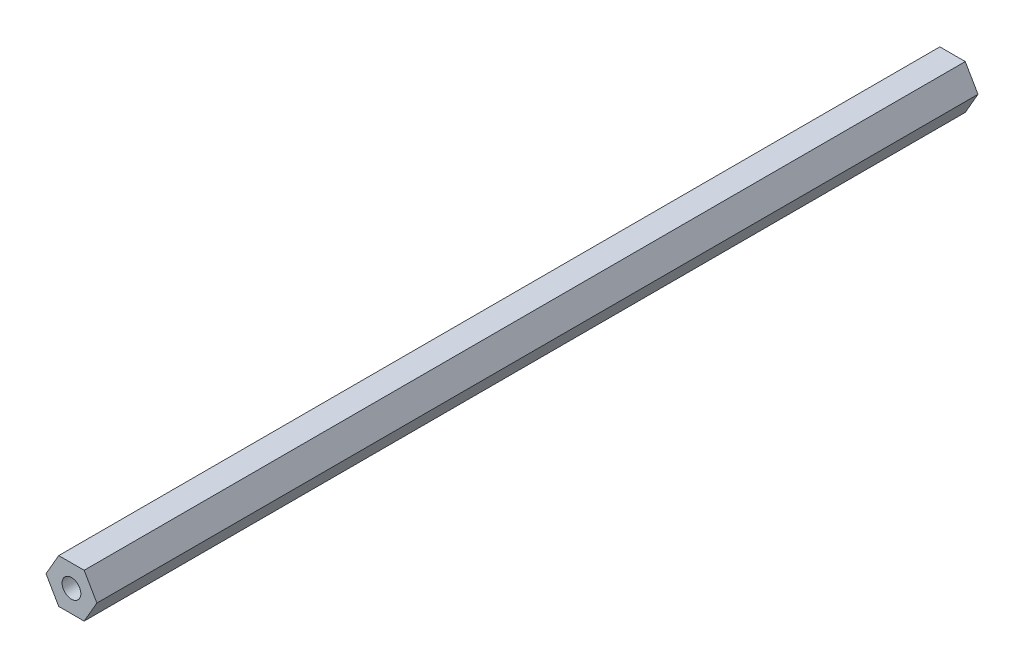
ISO-10303-21;
HEADER;
FILE_DESCRIPTION(('STEP AP214'),'2;1');
FILE_NAME('part.step','',(''),(''),'','','');
FILE_SCHEMA(('AUTOMOTIVE_DESIGN { 1 0 10303 214 1 1 1 1 }'));
ENDSEC;
DATA;
#1=APPLICATION_CONTEXT('core data for automotive mechanical design processes');
#2=APPLICATION_PROTOCOL_DEFINITION('international standard','automotive_design',2000,#1);
#3=PRODUCT_CONTEXT('',#1,'mechanical');
#4=PRODUCT('Part','Part','',(#3));
#5=PRODUCT_RELATED_PRODUCT_CATEGORY('part','',(#4));
#6=PRODUCT_DEFINITION_FORMATION('','',#4);
#7=PRODUCT_DEFINITION_CONTEXT('part definition',#1,'design');
#8=PRODUCT_DEFINITION('design','',#6,#7);
#9=PRODUCT_DEFINITION_SHAPE('','',#8);
#10=(LENGTH_UNIT() NAMED_UNIT(*) SI_UNIT(.MILLI.,.METRE.));
#11=(NAMED_UNIT(*) PLANE_ANGLE_UNIT() SI_UNIT($,.RADIAN.));
#12=(NAMED_UNIT(*) SI_UNIT($,.STERADIAN.) SOLID_ANGLE_UNIT());
#13=UNCERTAINTY_MEASURE_WITH_UNIT(LENGTH_MEASURE(1.E-05),#10,'distance_accuracy_value','');
#14=(GEOMETRIC_REPRESENTATION_CONTEXT(3) GLOBAL_UNCERTAINTY_ASSIGNED_CONTEXT((#13)) GLOBAL_UNIT_ASSIGNED_CONTEXT((#10,
#11,#12)) REPRESENTATION_CONTEXT('',''));
#15=CARTESIAN_POINT('',(0.,0.,0.));
#16=DIRECTION('',(0.,0.,1.));
#17=DIRECTION('',(1.,0.,0.));
#18=AXIS2_PLACEMENT_3D('',#15,#16,#17);
#19=CARTESIAN_POINT('',(3.66617420935412,-6.35,127.));
#20=DIRECTION('',(-0.866025403784439,0.5,0.));
#21=DIRECTION('',(-0.5,-0.866025403784439,0.));
#22=AXIS2_PLACEMENT_3D('',#19,#20,#21);
#23=PLANE('',#22);
#24=DIRECTION('',(0.5,0.866025403784439,0.));
#25=VECTOR('',#24,1.);
#26=CARTESIAN_POINT('',(3.66617420935412,-6.35,-127.));
#27=LINE('',#26,#25);
#28=CARTESIAN_POINT('',(3.66617420935412,-6.35,-127.));
#29=VERTEX_POINT('',#28);
#30=CARTESIAN_POINT('',(7.33234841870824,0.,-127.));
#31=VERTEX_POINT('',#30);
#32=EDGE_CURVE('E122',#29,#31,#27,.T.);
#33=ORIENTED_EDGE('',*,*,#32,.T.);
#34=DIRECTION('',(0.,0.,-1.));
#35=VECTOR('',#34,1.);
#36=CARTESIAN_POINT('',(7.33234841870824,0.,127.));
#37=LINE('',#36,#35);
#38=CARTESIAN_POINT('',(7.33234841870824,0.,127.));
#39=VERTEX_POINT('',#38);
#40=EDGE_CURVE('E11',#39,#31,#37,.T.);
#41=ORIENTED_EDGE('',*,*,#40,.F.);
#42=DIRECTION('',(0.5,0.866025403784439,0.));
#43=VECTOR('',#42,1.);
#44=CARTESIAN_POINT('',(3.66617420935412,-6.35,127.));
#45=LINE('',#44,#43);
#46=CARTESIAN_POINT('',(3.66617420935412,-6.35,127.));
#47=VERTEX_POINT('',#46);
#48=EDGE_CURVE('E133',#47,#39,#45,.T.);
#49=ORIENTED_EDGE('',*,*,#48,.F.);
#50=DIRECTION('',(0.,0.,-1.));
#51=VECTOR('',#50,1.);
#52=CARTESIAN_POINT('',(3.66617420935412,-6.35,127.));
#53=LINE('',#52,#51);
#54=EDGE_CURVE('E118',#47,#29,#53,.T.);
#55=ORIENTED_EDGE('',*,*,#54,.T.);
#56=EDGE_LOOP('',(#33,#41,#49,#55));
#57=FACE_BOUND('',#56,.T.);
#58=ADVANCED_FACE('F35',(#57),#23,.F.);
#59=CARTESIAN_POINT('',(7.33234841870824,0.,127.));
#60=DIRECTION('',(-0.866025403784439,-0.5,0.));
#61=DIRECTION('',(0.5,-0.866025403784439,0.));
#62=AXIS2_PLACEMENT_3D('',#59,#60,#61);
#63=PLANE('',#62);
#64=DIRECTION('',(-0.5,0.866025403784439,0.));
#65=VECTOR('',#64,1.);
#66=CARTESIAN_POINT('',(7.33234841870824,0.,-127.));
#67=LINE('',#66,#65);
#68=CARTESIAN_POINT('',(3.66617420935412,6.35000000000001,-127.));
#69=VERTEX_POINT('',#68);
#70=EDGE_CURVE('E125',#31,#69,#67,.T.);
#71=ORIENTED_EDGE('',*,*,#70,.T.);
#72=DIRECTION('',(0.,0.,-1.));
#73=VECTOR('',#72,1.);
#74=CARTESIAN_POINT('',(3.66617420935412,6.35000000000001,127.));
#75=LINE('',#74,#73);
#76=CARTESIAN_POINT('',(3.66617420935412,6.35000000000001,127.));
#77=VERTEX_POINT('',#76);
#78=EDGE_CURVE('E43',#77,#69,#75,.T.);
#79=ORIENTED_EDGE('',*,*,#78,.F.);
#80=DIRECTION('',(-0.5,0.866025403784439,0.));
#81=VECTOR('',#80,1.);
#82=CARTESIAN_POINT('',(7.33234841870824,0.,127.));
#83=LINE('',#82,#81);
#84=EDGE_CURVE('E89',#39,#77,#83,.T.);
#85=ORIENTED_EDGE('',*,*,#84,.F.);
#86=ORIENTED_EDGE('',*,*,#40,.T.);
#87=EDGE_LOOP('',(#71,#79,#85,#86));
#88=FACE_BOUND('',#87,.T.);
#89=ADVANCED_FACE('F158',(#88),#63,.F.);
#90=CARTESIAN_POINT('',(3.66617420935412,6.35000000000001,127.));
#91=DIRECTION('',(0.,-1.,0.));
#92=DIRECTION('',(0.,0.,-1.));
#93=AXIS2_PLACEMENT_3D('',#90,#91,#92);
#94=PLANE('',#93);
#95=DIRECTION('',(-1.,0.,0.));
#96=VECTOR('',#95,1.);
#97=CARTESIAN_POINT('',(3.66617420935412,6.35000000000001,-127.));
#98=LINE('',#97,#96);
#99=CARTESIAN_POINT('',(-3.66617420935412,6.35000000000001,-127.));
#100=VERTEX_POINT('',#99);
#101=EDGE_CURVE('E128',#69,#100,#98,.T.);
#102=ORIENTED_EDGE('',*,*,#101,.T.);
#103=DIRECTION('',(0.,0.,-1.));
#104=VECTOR('',#103,1.);
#105=CARTESIAN_POINT('',(-3.66617420935412,6.35000000000001,127.));
#106=LINE('',#105,#104);
#107=CARTESIAN_POINT('',(-3.66617420935412,6.35000000000001,127.));
#108=VERTEX_POINT('',#107);
#109=EDGE_CURVE('E113',#108,#100,#106,.T.);
#110=ORIENTED_EDGE('',*,*,#109,.F.);
#111=DIRECTION('',(-1.,0.,0.));
#112=VECTOR('',#111,1.);
#113=CARTESIAN_POINT('',(3.66617420935412,6.35000000000001,127.));
#114=LINE('',#113,#112);
#115=EDGE_CURVE('E104',#77,#108,#114,.T.);
#116=ORIENTED_EDGE('',*,*,#115,.F.);
#117=ORIENTED_EDGE('',*,*,#78,.T.);
#118=EDGE_LOOP('',(#102,#110,#116,#117));
#119=FACE_BOUND('',#118,.T.);
#120=ADVANCED_FACE('F139',(#119),#94,.F.);
#121=CARTESIAN_POINT('',(-3.66617420935412,6.35000000000001,127.));
#122=DIRECTION('',(0.866025403784439,-0.5,0.));
#123=DIRECTION('',(0.5,0.866025403784439,0.));
#124=AXIS2_PLACEMENT_3D('',#121,#122,#123);
#125=PLANE('',#124);
#126=DIRECTION('',(-0.5,-0.866025403784439,0.));
#127=VECTOR('',#126,1.);
#128=CARTESIAN_POINT('',(-3.66617420935412,6.35000000000001,-127.));
#129=LINE('',#128,#127);
#130=CARTESIAN_POINT('',(-7.33234841870825,0.,-127.));
#131=VERTEX_POINT('',#130);
#132=EDGE_CURVE('E112',#100,#131,#129,.T.);
#133=ORIENTED_EDGE('',*,*,#132,.T.);
#134=DIRECTION('',(0.,0.,-1.));
#135=VECTOR('',#134,1.);
#136=CARTESIAN_POINT('',(-7.33234841870825,0.,127.));
#137=LINE('',#136,#135);
#138=CARTESIAN_POINT('',(-7.33234841870825,0.,127.));
#139=VERTEX_POINT('',#138);
#140=EDGE_CURVE('E109',#139,#131,#137,.T.);
#141=ORIENTED_EDGE('',*,*,#140,.F.);
#142=DIRECTION('',(-0.5,-0.866025403784439,0.));
#143=VECTOR('',#142,1.);
#144=CARTESIAN_POINT('',(-3.66617420935412,6.35000000000001,127.));
#145=LINE('',#144,#143);
#146=EDGE_CURVE('E98',#108,#139,#145,.T.);
#147=ORIENTED_EDGE('',*,*,#146,.F.);
#148=ORIENTED_EDGE('',*,*,#109,.T.);
#149=EDGE_LOOP('',(#133,#141,#147,#148));
#150=FACE_BOUND('',#149,.T.);
#151=ADVANCED_FACE('F110',(#150),#125,.F.);
#152=CARTESIAN_POINT('',(-7.33234841870825,0.,127.));
#153=DIRECTION('',(0.866025403784439,0.5,0.));
#154=DIRECTION('',(-0.5,0.866025403784439,0.));
#155=AXIS2_PLACEMENT_3D('',#152,#153,#154);
#156=PLANE('',#155);
#157=DIRECTION('',(0.5,-0.866025403784439,0.));
#158=VECTOR('',#157,1.);
#159=CARTESIAN_POINT('',(-7.33234841870825,0.,-127.));
#160=LINE('',#159,#158);
#161=CARTESIAN_POINT('',(-3.66617420935413,-6.35,-127.));
#162=VERTEX_POINT('',#161);
#163=EDGE_CURVE('E75',#131,#162,#160,.T.);
#164=ORIENTED_EDGE('',*,*,#163,.T.);
#165=DIRECTION('',(0.,0.,-1.));
#166=VECTOR('',#165,1.);
#167=CARTESIAN_POINT('',(-3.66617420935413,-6.35,127.));
#168=LINE('',#167,#166);
#169=CARTESIAN_POINT('',(-3.66617420935413,-6.35,127.));
#170=VERTEX_POINT('',#169);
#171=EDGE_CURVE('E114',#170,#162,#168,.T.);
#172=ORIENTED_EDGE('',*,*,#171,.F.);
#173=DIRECTION('',(0.5,-0.866025403784439,0.));
#174=VECTOR('',#173,1.);
#175=CARTESIAN_POINT('',(-7.33234841870825,0.,127.));
#176=LINE('',#175,#174);
#177=EDGE_CURVE('E102',#139,#170,#176,.T.);
#178=ORIENTED_EDGE('',*,*,#177,.F.);
#179=ORIENTED_EDGE('',*,*,#140,.T.);
#180=EDGE_LOOP('',(#164,#172,#178,#179));
#181=FACE_BOUND('',#180,.T.);
#182=ADVANCED_FACE('F116',(#181),#156,.F.);
#183=CARTESIAN_POINT('',(-3.66617420935413,-6.35,127.));
#184=DIRECTION('',(0.,1.,0.));
#185=DIRECTION('',(-1.,0.,0.));
#186=AXIS2_PLACEMENT_3D('',#183,#184,#185);
#187=PLANE('',#186);
#188=DIRECTION('',(1.,0.,0.));
#189=VECTOR('',#188,1.);
#190=CARTESIAN_POINT('',(-3.66617420935413,-6.35,-127.));
#191=LINE('',#190,#189);
#192=EDGE_CURVE('E81',#162,#29,#191,.T.);
#193=ORIENTED_EDGE('',*,*,#192,.T.);
#194=ORIENTED_EDGE('',*,*,#54,.F.);
#195=DIRECTION('',(1.,0.,0.));
#196=VECTOR('',#195,1.);
#197=CARTESIAN_POINT('',(-3.66617420935413,-6.35,127.));
#198=LINE('',#197,#196);
#199=EDGE_CURVE('E51',#170,#47,#198,.T.);
#200=ORIENTED_EDGE('',*,*,#199,.F.);
#201=ORIENTED_EDGE('',*,*,#171,.T.);
#202=EDGE_LOOP('',(#193,#194,#200,#201));
#203=FACE_BOUND('',#202,.T.);
#204=ADVANCED_FACE('F146',(#203),#187,.F.);
#205=CARTESIAN_POINT('',(0.,0.,127.));
#206=DIRECTION('',(0.,0.,1.));
#207=DIRECTION('',(1.,0.,0.));
#208=AXIS2_PLACEMENT_3D('',#205,#206,#207);
#209=PLANE('',#208);
#210=CARTESIAN_POINT('',(0.,0.,127.));
#211=DIRECTION('',(0.,0.,1.));
#212=DIRECTION('',(1.,0.,0.));
#213=AXIS2_PLACEMENT_3D('',#210,#211,#212);
#214=CIRCLE('',#213,2.7051);
#215=CARTESIAN_POINT('',(2.7051,0.,127.));
#216=VERTEX_POINT('',#215);
#217=EDGE_CURVE('E244',#216,#216,#214,.T.);
#218=ORIENTED_EDGE('',*,*,#217,.F.);
#219=EDGE_LOOP('',(#218));
#220=FACE_BOUND('',#219,.T.);
#221=ORIENTED_EDGE('',*,*,#48,.T.);
#222=ORIENTED_EDGE('',*,*,#84,.T.);
#223=ORIENTED_EDGE('',*,*,#115,.T.);
#224=ORIENTED_EDGE('',*,*,#146,.T.);
#225=ORIENTED_EDGE('',*,*,#177,.T.);
#226=ORIENTED_EDGE('',*,*,#199,.T.);
#227=EDGE_LOOP('',(#221,#222,#223,#224,#225,#226));
#228=FACE_BOUND('',#227,.T.);
#229=ADVANCED_FACE('F100',(#220,#228),#209,.T.);
#230=CARTESIAN_POINT('',(0.,0.,-127.));
#231=DIRECTION('',(0.,0.,1.));
#232=DIRECTION('',(1.,0.,0.));
#233=AXIS2_PLACEMENT_3D('',#230,#231,#232);
#234=PLANE('',#233);
#235=CARTESIAN_POINT('',(0.,0.,-127.));
#236=DIRECTION('',(0.,0.,-1.));
#237=DIRECTION('',(-1.,0.,0.));
#238=AXIS2_PLACEMENT_3D('',#235,#236,#237);
#239=CIRCLE('',#238,2.7051);
#240=CARTESIAN_POINT('',(-2.7051,0.,-127.));
#241=VERTEX_POINT('',#240);
#242=EDGE_CURVE('E246',#241,#241,#239,.T.);
#243=ORIENTED_EDGE('',*,*,#242,.F.);
#244=EDGE_LOOP('',(#243));
#245=FACE_BOUND('',#244,.T.);
#246=ORIENTED_EDGE('',*,*,#32,.F.);
#247=ORIENTED_EDGE('',*,*,#192,.F.);
#248=ORIENTED_EDGE('',*,*,#163,.F.);
#249=ORIENTED_EDGE('',*,*,#132,.F.);
#250=ORIENTED_EDGE('',*,*,#101,.F.);
#251=ORIENTED_EDGE('',*,*,#70,.F.);
#252=EDGE_LOOP('',(#246,#247,#248,#249,#250,#251));
#253=FACE_BOUND('',#252,.T.);
#254=ADVANCED_FACE('F142',(#245,#253),#234,.F.);
#255=CARTESIAN_POINT('',(0.,0.,-98.806));
#256=DIRECTION('',(0.,0.,-1.));
#257=DIRECTION('',(-1.,0.,0.));
#258=AXIS2_PLACEMENT_3D('',#255,#256,#257);
#259=CONICAL_SURFACE('',#258,2.70509999999999,1.02974425867665);
#260=CARTESIAN_POINT('',(0.,0.,-97.1806119394685));
#261=VERTEX_POINT('',#260);
#262=VERTEX_LOOP('',#261);
#263=FACE_BOUND('',#262,.T.);
#264=CARTESIAN_POINT('',(0.,0.,-98.806));
#265=DIRECTION('',(0.,0.,-1.));
#266=DIRECTION('',(-1.,0.,0.));
#267=AXIS2_PLACEMENT_3D('',#264,#265,#266);
#268=CIRCLE('',#267,2.70509999999999);
#269=CARTESIAN_POINT('',(-2.70509999999999,0.,-98.806));
#270=VERTEX_POINT('',#269);
#271=EDGE_CURVE('E126',#270,#270,#268,.T.);
#272=ORIENTED_EDGE('',*,*,#271,.T.);
#273=EDGE_LOOP('',(#272));
#274=FACE_BOUND('',#273,.T.);
#275=ADVANCED_FACE('F195',(#263,#274),#259,.F.);
#276=CARTESIAN_POINT('',(0.,0.,-127.));
#277=DIRECTION('',(0.,0.,-1.));
#278=DIRECTION('',(-1.,0.,0.));
#279=AXIS2_PLACEMENT_3D('',#276,#277,#278);
#280=CYLINDRICAL_SURFACE('',#279,2.70509999999999);
#281=ORIENTED_EDGE('',*,*,#271,.F.);
#282=EDGE_LOOP('',(#281));
#283=FACE_BOUND('',#282,.T.);
#284=ORIENTED_EDGE('',*,*,#242,.T.);
#285=EDGE_LOOP('',(#284));
#286=FACE_BOUND('',#285,.T.);
#287=ADVANCED_FACE('F204',(#283,#286),#280,.F.);
#288=CARTESIAN_POINT('',(0.,0.,98.806));
#289=DIRECTION('',(0.,0.,1.));
#290=DIRECTION('',(1.,0.,0.));
#291=AXIS2_PLACEMENT_3D('',#288,#289,#290);
#292=CONICAL_SURFACE('',#291,2.70509999999999,1.02974425867665);
#293=CARTESIAN_POINT('',(0.,0.,97.1806119394685));
#294=VERTEX_POINT('',#293);
#295=VERTEX_LOOP('',#294);
#296=FACE_BOUND('',#295,.T.);
#297=CARTESIAN_POINT('',(0.,0.,98.806));
#298=DIRECTION('',(0.,0.,1.));
#299=DIRECTION('',(1.,0.,0.));
#300=AXIS2_PLACEMENT_3D('',#297,#298,#299);
#301=CIRCLE('',#300,2.70509999999999);
#302=CARTESIAN_POINT('',(2.70509999999999,0.,98.806));
#303=VERTEX_POINT('',#302);
#304=EDGE_CURVE('E241',#303,#303,#301,.T.);
#305=ORIENTED_EDGE('',*,*,#304,.T.);
#306=EDGE_LOOP('',(#305));
#307=FACE_BOUND('',#306,.T.);
#308=ADVANCED_FACE('F214',(#296,#307),#292,.F.);
#309=CARTESIAN_POINT('',(0.,0.,127.));
#310=DIRECTION('',(0.,0.,1.));
#311=DIRECTION('',(1.,0.,0.));
#312=AXIS2_PLACEMENT_3D('',#309,#310,#311);
#313=CYLINDRICAL_SURFACE('',#312,2.70509999999999);
#314=ORIENTED_EDGE('',*,*,#304,.F.);
#315=EDGE_LOOP('',(#314));
#316=FACE_BOUND('',#315,.T.);
#317=ORIENTED_EDGE('',*,*,#217,.T.);
#318=EDGE_LOOP('',(#317));
#319=FACE_BOUND('',#318,.T.);
#320=ADVANCED_FACE('F224',(#316,#319),#313,.F.);
#321=CLOSED_SHELL('',(#58,#89,#120,#151,#182,#204,#229,#254,#275,#287,#308,#320));
#322=MANIFOLD_SOLID_BREP('B2',#321);
#323=ADVANCED_BREP_SHAPE_REPRESENTATION('',(#18,#322),#14);
#324=SHAPE_DEFINITION_REPRESENTATION(#9,#323);
ENDSEC;
END-ISO-10303-21;
